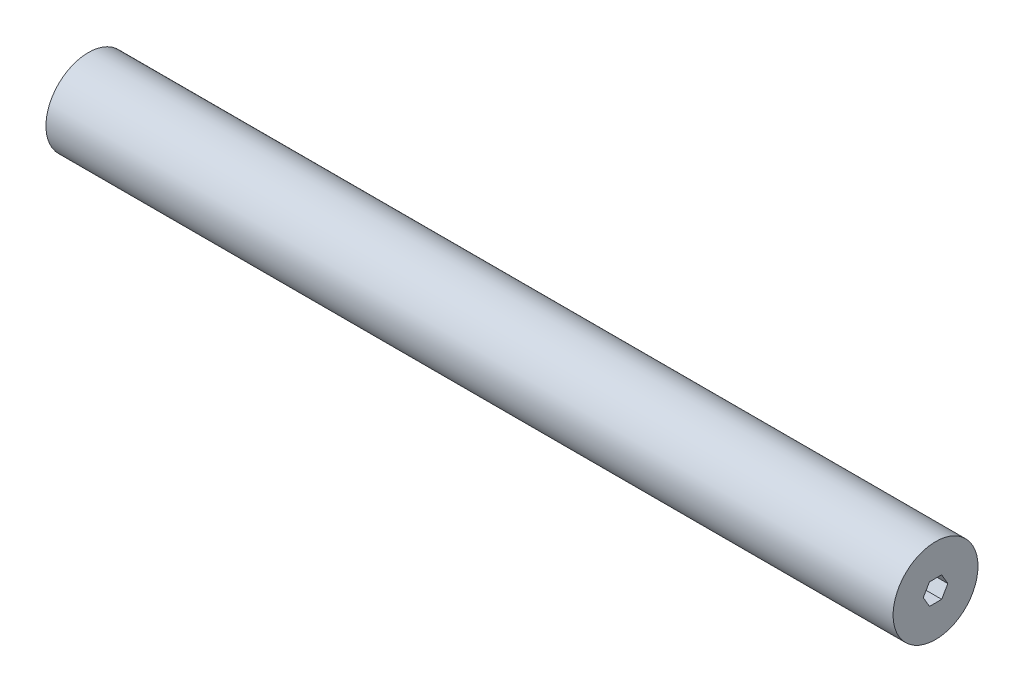
ISO-10303-21;
HEADER;
FILE_DESCRIPTION(('STEP AP214'),'2;1');
FILE_NAME('part.step','',(''),(''),'','','');
FILE_SCHEMA(('AUTOMOTIVE_DESIGN { 1 0 10303 214 1 1 1 1 }'));
ENDSEC;
DATA;
#1=APPLICATION_CONTEXT('core data for automotive mechanical design processes');
#2=APPLICATION_PROTOCOL_DEFINITION('international standard','automotive_design',2000,#1);
#3=PRODUCT_CONTEXT('',#1,'mechanical');
#4=PRODUCT('Part','Part','',(#3));
#5=PRODUCT_RELATED_PRODUCT_CATEGORY('part','',(#4));
#6=PRODUCT_DEFINITION_FORMATION('','',#4);
#7=PRODUCT_DEFINITION_CONTEXT('part definition',#1,'design');
#8=PRODUCT_DEFINITION('design','',#6,#7);
#9=PRODUCT_DEFINITION_SHAPE('','',#8);
#10=(LENGTH_UNIT() NAMED_UNIT(*) SI_UNIT(.MILLI.,.METRE.));
#11=(NAMED_UNIT(*) PLANE_ANGLE_UNIT() SI_UNIT($,.RADIAN.));
#12=(NAMED_UNIT(*) SI_UNIT($,.STERADIAN.) SOLID_ANGLE_UNIT());
#13=UNCERTAINTY_MEASURE_WITH_UNIT(LENGTH_MEASURE(1.E-05),#10,'distance_accuracy_value','');
#14=(GEOMETRIC_REPRESENTATION_CONTEXT(3) GLOBAL_UNCERTAINTY_ASSIGNED_CONTEXT((#13)) GLOBAL_UNIT_ASSIGNED_CONTEXT((#10,
#11,#12)) REPRESENTATION_CONTEXT('',''));
#15=CARTESIAN_POINT('',(0.,0.,0.));
#16=DIRECTION('',(0.,0.,1.));
#17=DIRECTION('',(1.,0.,0.));
#18=AXIS2_PLACEMENT_3D('',#15,#16,#17);
#19=CARTESIAN_POINT('',(507.,0.,0.));
#20=DIRECTION('',(1.,0.,0.));
#21=DIRECTION('',(0.,0.,-1.));
#22=AXIS2_PLACEMENT_3D('',#19,#20,#21);
#23=PLANE('',#22);
#24=CARTESIAN_POINT('',(507.,0.,0.));
#25=DIRECTION('',(1.,0.,0.));
#26=DIRECTION('',(0.,0.,-1.));
#27=AXIS2_PLACEMENT_3D('',#24,#25,#26);
#28=CIRCLE('',#27,25.4);
#29=CARTESIAN_POINT('',(507.,0.,-25.4));
#30=VERTEX_POINT('',#29);
#31=EDGE_CURVE('E11',#30,#30,#28,.T.);
#32=ORIENTED_EDGE('',*,*,#31,.T.);
#33=EDGE_LOOP('',(#32));
#34=FACE_BOUND('',#33,.T.);
#35=DIRECTION('',(0.,-0.866025403784439,-0.5));
#36=VECTOR('',#35,1.);
#37=CARTESIAN_POINT('',(507.,0.,7.33234841870825));
#38=LINE('',#37,#36);
#39=CARTESIAN_POINT('',(507.,0.,7.33234841870825));
#40=VERTEX_POINT('',#39);
#41=CARTESIAN_POINT('',(507.,-6.35,3.66617420935413));
#42=VERTEX_POINT('',#41);
#43=EDGE_CURVE('E102',#40,#42,#38,.T.);
#44=ORIENTED_EDGE('',*,*,#43,.F.);
#45=DIRECTION('',(0.,-0.866025403784439,0.5));
#46=VECTOR('',#45,1.);
#47=CARTESIAN_POINT('',(507.,6.35,3.66617420935412));
#48=LINE('',#47,#46);
#49=CARTESIAN_POINT('',(507.,6.35,3.66617420935412));
#50=VERTEX_POINT('',#49);
#51=EDGE_CURVE('E93',#50,#40,#48,.T.);
#52=ORIENTED_EDGE('',*,*,#51,.F.);
#53=DIRECTION('',(0.,0.,1.));
#54=VECTOR('',#53,1.);
#55=CARTESIAN_POINT('',(507.,6.35,-3.66617420935412));
#56=LINE('',#55,#54);
#57=CARTESIAN_POINT('',(507.,6.35,-3.66617420935412));
#58=VERTEX_POINT('',#57);
#59=EDGE_CURVE('E127',#58,#50,#56,.T.);
#60=ORIENTED_EDGE('',*,*,#59,.F.);
#61=DIRECTION('',(0.,0.866025403784439,0.5));
#62=VECTOR('',#61,1.);
#63=CARTESIAN_POINT('',(507.,0.,-7.33234841870825));
#64=LINE('',#63,#62);
#65=CARTESIAN_POINT('',(507.,0.,-7.33234841870825));
#66=VERTEX_POINT('',#65);
#67=EDGE_CURVE('E124',#66,#58,#64,.T.);
#68=ORIENTED_EDGE('',*,*,#67,.F.);
#69=DIRECTION('',(0.,0.866025403784439,-0.5));
#70=VECTOR('',#69,1.);
#71=CARTESIAN_POINT('',(507.,-6.35,-3.66617420935412));
#72=LINE('',#71,#70);
#73=CARTESIAN_POINT('',(507.,-6.35,-3.66617420935412));
#74=VERTEX_POINT('',#73);
#75=EDGE_CURVE('E119',#74,#66,#72,.T.);
#76=ORIENTED_EDGE('',*,*,#75,.F.);
#77=DIRECTION('',(0.,0.,-1.));
#78=VECTOR('',#77,1.);
#79=CARTESIAN_POINT('',(507.,-6.35,3.66617420935413));
#80=LINE('',#79,#78);
#81=EDGE_CURVE('E115',#42,#74,#80,.T.);
#82=ORIENTED_EDGE('',*,*,#81,.F.);
#83=EDGE_LOOP('',(#44,#52,#60,#68,#76,#82));
#84=FACE_BOUND('',#83,.T.);
#85=ADVANCED_FACE('F39',(#34,#84),#23,.T.);
#86=CARTESIAN_POINT('',(0.,0.,0.));
#87=DIRECTION('',(1.,0.,0.));
#88=DIRECTION('',(0.,0.,-1.));
#89=AXIS2_PLACEMENT_3D('',#86,#87,#88);
#90=PLANE('',#89);
#91=CARTESIAN_POINT('',(0.,0.,0.));
#92=DIRECTION('',(1.,0.,0.));
#93=DIRECTION('',(0.,0.,-1.));
#94=AXIS2_PLACEMENT_3D('',#91,#92,#93);
#95=CIRCLE('',#94,25.4);
#96=CARTESIAN_POINT('',(0.,0.,-25.4));
#97=VERTEX_POINT('',#96);
#98=EDGE_CURVE('E43',#97,#97,#95,.T.);
#99=ORIENTED_EDGE('',*,*,#98,.F.);
#100=EDGE_LOOP('',(#99));
#101=FACE_BOUND('',#100,.T.);
#102=DIRECTION('',(0.,-0.866025403784439,0.5));
#103=VECTOR('',#102,1.);
#104=CARTESIAN_POINT('',(0.,6.35,3.66617420935412));
#105=LINE('',#104,#103);
#106=CARTESIAN_POINT('',(0.,6.35,3.66617420935412));
#107=VERTEX_POINT('',#106);
#108=CARTESIAN_POINT('',(0.,0.,7.33234841870825));
#109=VERTEX_POINT('',#108);
#110=EDGE_CURVE('E63',#107,#109,#105,.T.);
#111=ORIENTED_EDGE('',*,*,#110,.T.);
#112=DIRECTION('',(0.,-0.866025403784439,-0.5));
#113=VECTOR('',#112,1.);
#114=CARTESIAN_POINT('',(0.,0.,7.33234841870825));
#115=LINE('',#114,#113);
#116=CARTESIAN_POINT('',(0.,-6.35,3.66617420935413));
#117=VERTEX_POINT('',#116);
#118=EDGE_CURVE('E109',#109,#117,#115,.T.);
#119=ORIENTED_EDGE('',*,*,#118,.T.);
#120=DIRECTION('',(0.,0.,-1.));
#121=VECTOR('',#120,1.);
#122=CARTESIAN_POINT('',(0.,-6.35,3.66617420935413));
#123=LINE('',#122,#121);
#124=CARTESIAN_POINT('',(0.,-6.35,-3.66617420935412));
#125=VERTEX_POINT('',#124);
#126=EDGE_CURVE('E134',#117,#125,#123,.T.);
#127=ORIENTED_EDGE('',*,*,#126,.T.);
#128=DIRECTION('',(0.,0.866025403784439,-0.5));
#129=VECTOR('',#128,1.);
#130=CARTESIAN_POINT('',(0.,-6.35,-3.66617420935412));
#131=LINE('',#130,#129);
#132=CARTESIAN_POINT('',(0.,0.,-7.33234841870825));
#133=VERTEX_POINT('',#132);
#134=EDGE_CURVE('E138',#125,#133,#131,.T.);
#135=ORIENTED_EDGE('',*,*,#134,.T.);
#136=DIRECTION('',(0.,0.866025403784439,0.5));
#137=VECTOR('',#136,1.);
#138=CARTESIAN_POINT('',(0.,0.,-7.33234841870825));
#139=LINE('',#138,#137);
#140=CARTESIAN_POINT('',(0.,6.35,-3.66617420935412));
#141=VERTEX_POINT('',#140);
#142=EDGE_CURVE('E142',#133,#141,#139,.T.);
#143=ORIENTED_EDGE('',*,*,#142,.T.);
#144=DIRECTION('',(0.,0.,1.));
#145=VECTOR('',#144,1.);
#146=CARTESIAN_POINT('',(0.,6.35,-3.66617420935412));
#147=LINE('',#146,#145);
#148=EDGE_CURVE('E103',#141,#107,#147,.T.);
#149=ORIENTED_EDGE('',*,*,#148,.T.);
#150=EDGE_LOOP('',(#111,#119,#127,#135,#143,#149));
#151=FACE_BOUND('',#150,.T.);
#152=ADVANCED_FACE('F166',(#101,#151),#90,.F.);
#153=CARTESIAN_POINT('',(507.,0.,0.));
#154=DIRECTION('',(-1.,0.,0.));
#155=DIRECTION('',(0.,0.,1.));
#156=AXIS2_PLACEMENT_3D('',#153,#154,#155);
#157=CYLINDRICAL_SURFACE('',#156,25.4);
#158=ORIENTED_EDGE('',*,*,#31,.F.);
#159=EDGE_LOOP('',(#158));
#160=FACE_BOUND('',#159,.T.);
#161=ORIENTED_EDGE('',*,*,#98,.T.);
#162=EDGE_LOOP('',(#161));
#163=FACE_BOUND('',#162,.T.);
#164=ADVANCED_FACE('F41',(#160,#163),#157,.T.);
#165=CARTESIAN_POINT('',(507.,6.35,3.66617420935412));
#166=DIRECTION('',(0.,-0.5,-0.866025403784439));
#167=DIRECTION('',(0.,0.866025403784439,-0.5));
#168=AXIS2_PLACEMENT_3D('',#165,#166,#167);
#169=PLANE('',#168);
#170=ORIENTED_EDGE('',*,*,#110,.F.);
#171=DIRECTION('',(-1.,0.,0.));
#172=VECTOR('',#171,1.);
#173=CARTESIAN_POINT('',(507.,6.35,3.66617420935412));
#174=LINE('',#173,#172);
#175=EDGE_CURVE('E97',#50,#107,#174,.T.);
#176=ORIENTED_EDGE('',*,*,#175,.F.);
#177=ORIENTED_EDGE('',*,*,#51,.T.);
#178=DIRECTION('',(-1.,0.,0.));
#179=VECTOR('',#178,1.);
#180=CARTESIAN_POINT('',(507.,0.,7.33234841870825));
#181=LINE('',#180,#179);
#182=EDGE_CURVE('E96',#40,#109,#181,.T.);
#183=ORIENTED_EDGE('',*,*,#182,.T.);
#184=EDGE_LOOP('',(#170,#176,#177,#183));
#185=FACE_BOUND('',#184,.T.);
#186=ADVANCED_FACE('F95',(#185),#169,.T.);
#187=CARTESIAN_POINT('',(507.,0.,7.33234841870825));
#188=DIRECTION('',(0.,0.5,-0.866025403784439));
#189=DIRECTION('',(0.,0.866025403784439,0.5));
#190=AXIS2_PLACEMENT_3D('',#187,#188,#189);
#191=PLANE('',#190);
#192=ORIENTED_EDGE('',*,*,#118,.F.);
#193=ORIENTED_EDGE('',*,*,#182,.F.);
#194=ORIENTED_EDGE('',*,*,#43,.T.);
#195=DIRECTION('',(-1.,0.,0.));
#196=VECTOR('',#195,1.);
#197=CARTESIAN_POINT('',(507.,-6.35,3.66617420935413));
#198=LINE('',#197,#196);
#199=EDGE_CURVE('E111',#42,#117,#198,.T.);
#200=ORIENTED_EDGE('',*,*,#199,.T.);
#201=EDGE_LOOP('',(#192,#193,#194,#200));
#202=FACE_BOUND('',#201,.T.);
#203=ADVANCED_FACE('F106',(#202),#191,.T.);
#204=CARTESIAN_POINT('',(507.,-6.35,3.66617420935413));
#205=DIRECTION('',(0.,1.,0.));
#206=DIRECTION('',(0.,0.,1.));
#207=AXIS2_PLACEMENT_3D('',#204,#205,#206);
#208=PLANE('',#207);
#209=ORIENTED_EDGE('',*,*,#126,.F.);
#210=ORIENTED_EDGE('',*,*,#199,.F.);
#211=ORIENTED_EDGE('',*,*,#81,.T.);
#212=DIRECTION('',(-1.,0.,0.));
#213=VECTOR('',#212,1.);
#214=CARTESIAN_POINT('',(507.,-6.35,-3.66617420935412));
#215=LINE('',#214,#213);
#216=EDGE_CURVE('E156',#74,#125,#215,.T.);
#217=ORIENTED_EDGE('',*,*,#216,.T.);
#218=EDGE_LOOP('',(#209,#210,#211,#217));
#219=FACE_BOUND('',#218,.T.);
#220=ADVANCED_FACE('F162',(#219),#208,.T.);
#221=CARTESIAN_POINT('',(507.,-6.35,-3.66617420935412));
#222=DIRECTION('',(0.,0.5,0.866025403784439));
#223=DIRECTION('',(0.,-0.866025403784439,0.5));
#224=AXIS2_PLACEMENT_3D('',#221,#222,#223);
#225=PLANE('',#224);
#226=ORIENTED_EDGE('',*,*,#134,.F.);
#227=ORIENTED_EDGE('',*,*,#216,.F.);
#228=ORIENTED_EDGE('',*,*,#75,.T.);
#229=DIRECTION('',(-1.,0.,0.));
#230=VECTOR('',#229,1.);
#231=CARTESIAN_POINT('',(507.,0.,-7.33234841870825));
#232=LINE('',#231,#230);
#233=EDGE_CURVE('E153',#66,#133,#232,.T.);
#234=ORIENTED_EDGE('',*,*,#233,.T.);
#235=EDGE_LOOP('',(#226,#227,#228,#234));
#236=FACE_BOUND('',#235,.T.);
#237=ADVANCED_FACE('F174',(#236),#225,.T.);
#238=CARTESIAN_POINT('',(507.,0.,-7.33234841870825));
#239=DIRECTION('',(0.,-0.5,0.866025403784439));
#240=DIRECTION('',(0.,-0.866025403784439,-0.5));
#241=AXIS2_PLACEMENT_3D('',#238,#239,#240);
#242=PLANE('',#241);
#243=ORIENTED_EDGE('',*,*,#142,.F.);
#244=ORIENTED_EDGE('',*,*,#233,.F.);
#245=ORIENTED_EDGE('',*,*,#67,.T.);
#246=DIRECTION('',(-1.,0.,0.));
#247=VECTOR('',#246,1.);
#248=CARTESIAN_POINT('',(507.,6.35,-3.66617420935412));
#249=LINE('',#248,#247);
#250=EDGE_CURVE('E55',#58,#141,#249,.T.);
#251=ORIENTED_EDGE('',*,*,#250,.T.);
#252=EDGE_LOOP('',(#243,#244,#245,#251));
#253=FACE_BOUND('',#252,.T.);
#254=ADVANCED_FACE('F172',(#253),#242,.T.);
#255=CARTESIAN_POINT('',(507.,6.35,-3.66617420935412));
#256=DIRECTION('',(0.,-1.,0.));
#257=DIRECTION('',(0.,0.,-1.));
#258=AXIS2_PLACEMENT_3D('',#255,#256,#257);
#259=PLANE('',#258);
#260=ORIENTED_EDGE('',*,*,#148,.F.);
#261=ORIENTED_EDGE('',*,*,#250,.F.);
#262=ORIENTED_EDGE('',*,*,#59,.T.);
#263=ORIENTED_EDGE('',*,*,#175,.T.);
#264=EDGE_LOOP('',(#260,#261,#262,#263));
#265=FACE_BOUND('',#264,.T.);
#266=ADVANCED_FACE('F168',(#265),#259,.T.);
#267=CLOSED_SHELL('',(#85,#152,#164,#186,#203,#220,#237,#254,#266));
#268=MANIFOLD_SOLID_BREP('B2',#267);
#269=ADVANCED_BREP_SHAPE_REPRESENTATION('',(#18,#268),#14);
#270=SHAPE_DEFINITION_REPRESENTATION(#9,#269);
ENDSEC;
END-ISO-10303-21;
